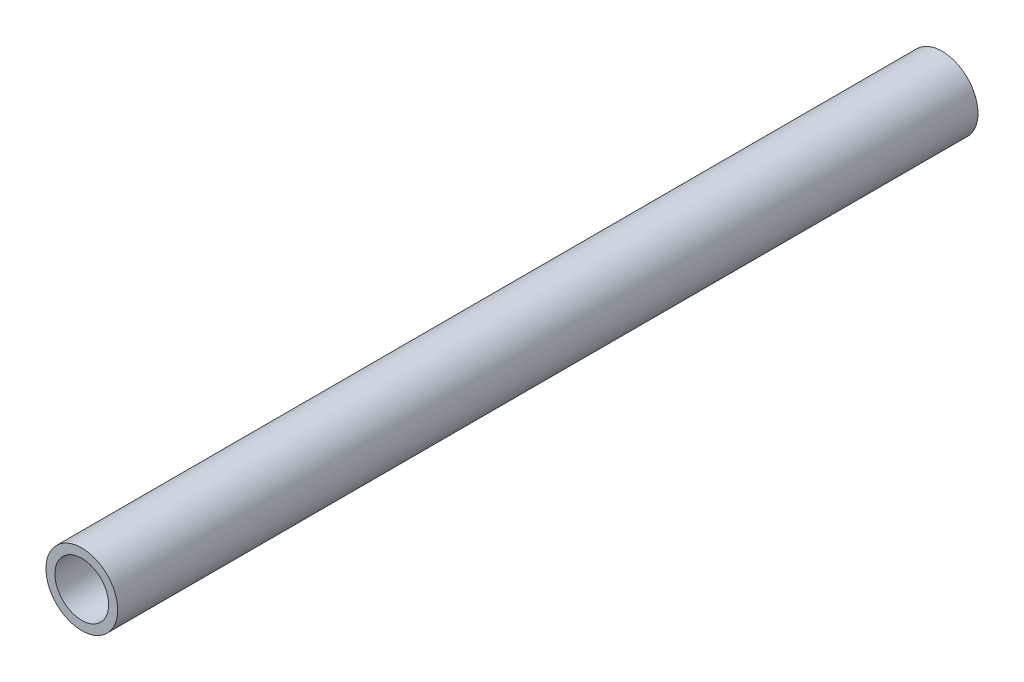
ISO-10303-21;
HEADER;
FILE_DESCRIPTION(('STEP AP214'),'2;1');
FILE_NAME('part.step','',(''),(''),'','','');
FILE_SCHEMA(('AUTOMOTIVE_DESIGN { 1 0 10303 214 1 1 1 1 }'));
ENDSEC;
DATA;
#1=APPLICATION_CONTEXT('core data for automotive mechanical design processes');
#2=APPLICATION_PROTOCOL_DEFINITION('international standard','automotive_design',2000,#1);
#3=PRODUCT_CONTEXT('',#1,'mechanical');
#4=PRODUCT('Part','Part','',(#3));
#5=PRODUCT_RELATED_PRODUCT_CATEGORY('part','',(#4));
#6=PRODUCT_DEFINITION_FORMATION('','',#4);
#7=PRODUCT_DEFINITION_CONTEXT('part definition',#1,'design');
#8=PRODUCT_DEFINITION('design','',#6,#7);
#9=PRODUCT_DEFINITION_SHAPE('','',#8);
#10=(LENGTH_UNIT() NAMED_UNIT(*) SI_UNIT(.MILLI.,.METRE.));
#11=(NAMED_UNIT(*) PLANE_ANGLE_UNIT() SI_UNIT($,.RADIAN.));
#12=(NAMED_UNIT(*) SI_UNIT($,.STERADIAN.) SOLID_ANGLE_UNIT());
#13=UNCERTAINTY_MEASURE_WITH_UNIT(LENGTH_MEASURE(1.E-05),#10,'distance_accuracy_value','');
#14=(GEOMETRIC_REPRESENTATION_CONTEXT(3) GLOBAL_UNCERTAINTY_ASSIGNED_CONTEXT((#13)) GLOBAL_UNIT_ASSIGNED_CONTEXT((#10,
#11,#12)) REPRESENTATION_CONTEXT('',''));
#15=CARTESIAN_POINT('',(0.,0.,0.));
#16=DIRECTION('',(0.,0.,1.));
#17=DIRECTION('',(1.,0.,0.));
#18=AXIS2_PLACEMENT_3D('',#15,#16,#17);
#19=CARTESIAN_POINT('',(0.,0.,48.));
#20=DIRECTION('',(0.,0.,-1.));
#21=DIRECTION('',(-1.,0.,0.));
#22=AXIS2_PLACEMENT_3D('',#19,#20,#21);
#23=CYLINDRICAL_SURFACE('',#22,4.);
#24=CARTESIAN_POINT('',(0.,0.,48.));
#25=DIRECTION('',(0.,0.,1.));
#26=DIRECTION('',(1.,0.,0.));
#27=AXIS2_PLACEMENT_3D('',#24,#25,#26);
#28=CIRCLE('',#27,4.);
#29=CARTESIAN_POINT('',(4.,0.,48.));
#30=VERTEX_POINT('',#29);
#31=EDGE_CURVE('E10',#30,#30,#28,.T.);
#32=ORIENTED_EDGE('',*,*,#31,.F.);
#33=EDGE_LOOP('',(#32));
#34=FACE_BOUND('',#33,.T.);
#35=CARTESIAN_POINT('',(0.,0.,-48.));
#36=DIRECTION('',(0.,0.,1.));
#37=DIRECTION('',(1.,0.,0.));
#38=AXIS2_PLACEMENT_3D('',#35,#36,#37);
#39=CIRCLE('',#38,4.);
#40=CARTESIAN_POINT('',(4.,0.,-48.));
#41=VERTEX_POINT('',#40);
#42=EDGE_CURVE('E40',#41,#41,#39,.T.);
#43=ORIENTED_EDGE('',*,*,#42,.T.);
#44=EDGE_LOOP('',(#43));
#45=FACE_BOUND('',#44,.T.);
#46=ADVANCED_FACE('F33',(#34,#45),#23,.T.);
#47=CARTESIAN_POINT('',(0.,0.,48.));
#48=DIRECTION('',(0.,0.,1.));
#49=DIRECTION('',(1.,0.,0.));
#50=AXIS2_PLACEMENT_3D('',#47,#48,#49);
#51=PLANE('',#50);
#52=CARTESIAN_POINT('',(0.,0.,48.));
#53=DIRECTION('',(0.,0.,1.));
#54=DIRECTION('',(1.,0.,0.));
#55=AXIS2_PLACEMENT_3D('',#52,#53,#54);
#56=CIRCLE('',#55,3.);
#57=CARTESIAN_POINT('',(3.,0.,48.));
#58=VERTEX_POINT('',#57);
#59=EDGE_CURVE('E46',#58,#58,#56,.T.);
#60=ORIENTED_EDGE('',*,*,#59,.F.);
#61=EDGE_LOOP('',(#60));
#62=FACE_BOUND('',#61,.T.);
#63=ORIENTED_EDGE('',*,*,#31,.T.);
#64=EDGE_LOOP('',(#63));
#65=FACE_BOUND('',#64,.T.);
#66=ADVANCED_FACE('F62',(#62,#65),#51,.T.);
#67=CARTESIAN_POINT('',(0.,0.,-48.));
#68=DIRECTION('',(0.,0.,1.));
#69=DIRECTION('',(1.,0.,0.));
#70=AXIS2_PLACEMENT_3D('',#67,#68,#69);
#71=PLANE('',#70);
#72=CARTESIAN_POINT('',(0.,0.,-48.));
#73=DIRECTION('',(0.,0.,1.));
#74=DIRECTION('',(1.,0.,0.));
#75=AXIS2_PLACEMENT_3D('',#72,#73,#74);
#76=CIRCLE('',#75,3.);
#77=CARTESIAN_POINT('',(3.,0.,-48.));
#78=VERTEX_POINT('',#77);
#79=EDGE_CURVE('E36',#78,#78,#76,.T.);
#80=ORIENTED_EDGE('',*,*,#79,.T.);
#81=EDGE_LOOP('',(#80));
#82=FACE_BOUND('',#81,.T.);
#83=ORIENTED_EDGE('',*,*,#42,.F.);
#84=EDGE_LOOP('',(#83));
#85=FACE_BOUND('',#84,.T.);
#86=ADVANCED_FACE('F53',(#82,#85),#71,.F.);
#87=CARTESIAN_POINT('',(0.,0.,-52.));
#88=DIRECTION('',(0.,0.,1.));
#89=DIRECTION('',(1.,0.,0.));
#90=AXIS2_PLACEMENT_3D('',#87,#88,#89);
#91=CYLINDRICAL_SURFACE('',#90,3.);
#92=CARTESIAN_POINT('',(3.,0.,48.));
#93=CARTESIAN_POINT('',(3.,0.,47.));
#94=CARTESIAN_POINT('',(3.,0.,46.));
#95=CARTESIAN_POINT('',(3.,0.,44.));
#96=CARTESIAN_POINT('',(3.,0.,43.));
#97=CARTESIAN_POINT('',(3.,0.,41.));
#98=CARTESIAN_POINT('',(3.,0.,40.));
#99=CARTESIAN_POINT('',(3.,0.,38.));
#100=CARTESIAN_POINT('',(3.,0.,37.));
#101=CARTESIAN_POINT('',(3.,0.,35.));
#102=CARTESIAN_POINT('',(3.,0.,34.));
#103=CARTESIAN_POINT('',(3.,0.,32.));
#104=CARTESIAN_POINT('',(3.,0.,31.));
#105=CARTESIAN_POINT('',(3.,0.,29.));
#106=CARTESIAN_POINT('',(3.,0.,28.));
#107=CARTESIAN_POINT('',(3.,0.,26.));
#108=CARTESIAN_POINT('',(3.,0.,25.));
#109=CARTESIAN_POINT('',(3.,0.,23.));
#110=CARTESIAN_POINT('',(3.,0.,22.));
#111=CARTESIAN_POINT('',(3.,0.,20.));
#112=CARTESIAN_POINT('',(3.,0.,19.));
#113=CARTESIAN_POINT('',(3.,0.,17.));
#114=CARTESIAN_POINT('',(3.,0.,16.));
#115=CARTESIAN_POINT('',(3.,0.,14.));
#116=CARTESIAN_POINT('',(3.,0.,13.));
#117=CARTESIAN_POINT('',(3.,0.,11.));
#118=CARTESIAN_POINT('',(3.,0.,10.));
#119=CARTESIAN_POINT('',(3.,0.,8.));
#120=CARTESIAN_POINT('',(3.,0.,7.));
#121=CARTESIAN_POINT('',(3.,0.,5.));
#122=CARTESIAN_POINT('',(3.,0.,4.));
#123=CARTESIAN_POINT('',(3.,0.,2.));
#124=CARTESIAN_POINT('',(3.,0.,1.));
#125=CARTESIAN_POINT('',(3.,0.,-1.));
#126=CARTESIAN_POINT('',(3.,0.,-2.));
#127=CARTESIAN_POINT('',(3.,0.,-4.));
#128=CARTESIAN_POINT('',(3.,0.,-5.));
#129=CARTESIAN_POINT('',(3.,0.,-7.));
#130=CARTESIAN_POINT('',(3.,0.,-8.));
#131=CARTESIAN_POINT('',(3.,0.,-10.));
#132=CARTESIAN_POINT('',(3.,0.,-11.));
#133=CARTESIAN_POINT('',(3.,0.,-13.));
#134=CARTESIAN_POINT('',(3.,0.,-14.));
#135=CARTESIAN_POINT('',(3.,0.,-16.));
#136=CARTESIAN_POINT('',(3.,0.,-17.));
#137=CARTESIAN_POINT('',(3.,0.,-19.));
#138=CARTESIAN_POINT('',(3.,0.,-20.));
#139=CARTESIAN_POINT('',(3.,0.,-22.));
#140=CARTESIAN_POINT('',(3.,0.,-23.));
#141=CARTESIAN_POINT('',(3.,0.,-25.));
#142=CARTESIAN_POINT('',(3.,0.,-26.));
#143=CARTESIAN_POINT('',(3.,0.,-28.));
#144=CARTESIAN_POINT('',(3.,0.,-29.));
#145=CARTESIAN_POINT('',(3.,0.,-31.));
#146=CARTESIAN_POINT('',(3.,0.,-32.));
#147=CARTESIAN_POINT('',(3.,0.,-34.));
#148=CARTESIAN_POINT('',(3.,0.,-35.));
#149=CARTESIAN_POINT('',(3.,0.,-37.));
#150=CARTESIAN_POINT('',(3.,0.,-38.));
#151=CARTESIAN_POINT('',(3.,0.,-40.));
#152=CARTESIAN_POINT('',(3.,0.,-41.));
#153=CARTESIAN_POINT('',(3.,0.,-43.));
#154=CARTESIAN_POINT('',(3.,0.,-44.));
#155=CARTESIAN_POINT('',(3.,0.,-46.));
#156=CARTESIAN_POINT('',(3.,0.,-47.));
#157=CARTESIAN_POINT('',(3.,0.,-48.));
#158=B_SPLINE_CURVE_WITH_KNOTS('',3,(#92,#93,#94,#95,#96,#97,#98,#99,#100,#101,#102,#103,#104,
#105,#106,#107,#108,#109,#110,#111,#112,#113,#114,#115,#116,#117,#118,#119,#120,#121,#122,#123,
#124,#125,#126,#127,#128,#129,#130,#131,#132,#133,#134,#135,#136,#137,#138,#139,#140,#141,#142,
#143,#144,#145,#146,#147,#148,#149,#150,#151,#152,#153,#154,#155,#156,#157),.UNSPECIFIED.,.F.,
.F.,(4,2,2,2,2,2,2,2,2,2,2,2,2,2,2,2,2,2,2,2,2,2,2,2,2,2,2,2,2,2,2,2,4),(0.,3.,6.00000000000001,
9.00000000000001,12.,15.,18.,21.,24.,27.,30.,33.,36.,39.,42.,45.,48.,51.,54.,57.,60.,63.,66.,
69.,72.,75.,78.,81.,84.,87.,90.,93.,96.),.UNSPECIFIED.);
#159=EDGE_CURVE('BSEAM56',#58,#78,#158,.T.);
#160=ORIENTED_EDGE('',*,*,#59,.T.);
#161=ORIENTED_EDGE('',*,*,#79,.F.);
#162=ORIENTED_EDGE('',*,*,#159,.T.);
#163=ORIENTED_EDGE('',*,*,#159,.F.);
#164=EDGE_LOOP('',(#160,#162,#161,#163));
#165=FACE_BOUND('',#164,.T.);
#166=ADVANCED_FACE('F56',(#165),#91,.F.);
#167=CLOSED_SHELL('',(#46,#66,#86,#166));
#168=MANIFOLD_SOLID_BREP('B2',#167);
#169=ADVANCED_BREP_SHAPE_REPRESENTATION('',(#18,#168),#14);
#170=SHAPE_DEFINITION_REPRESENTATION(#9,#169);
ENDSEC;
END-ISO-10303-21;
